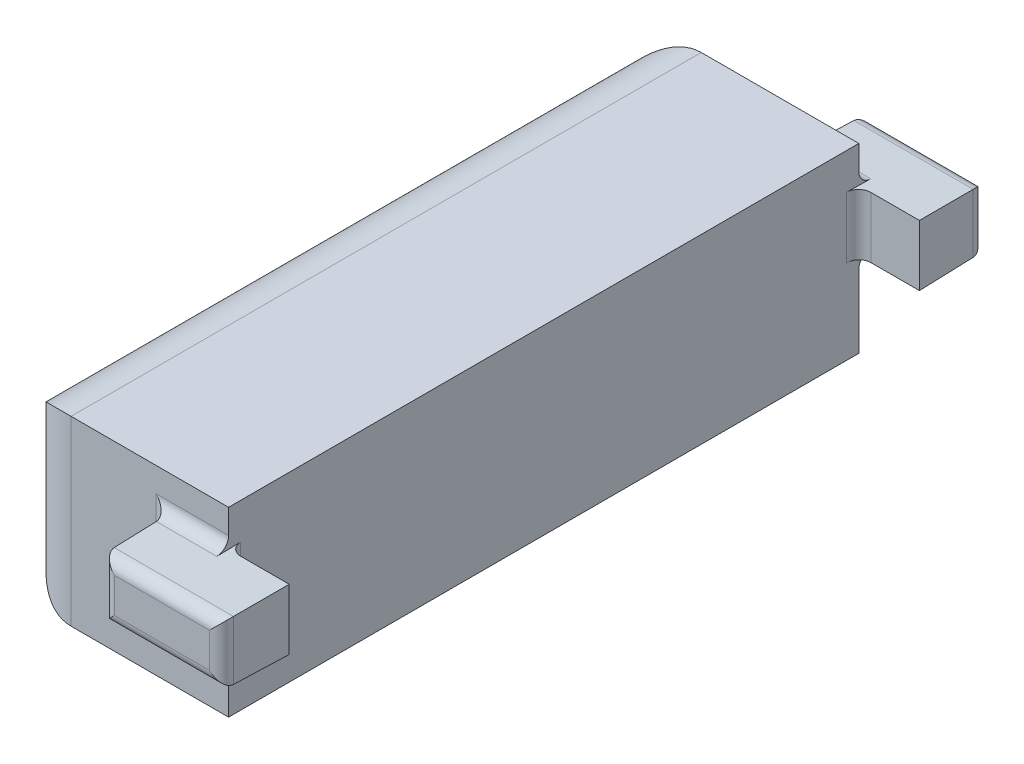
ISO-10303-21;
HEADER;
FILE_DESCRIPTION(('STEP AP214'),'2;1');
FILE_NAME('part.step','',(''),(''),'','','');
FILE_SCHEMA(('AUTOMOTIVE_DESIGN { 1 0 10303 214 1 1 1 1 }'));
ENDSEC;
DATA;
#1=APPLICATION_CONTEXT('core data for automotive mechanical design processes');
#2=APPLICATION_PROTOCOL_DEFINITION('international standard','automotive_design',2000,#1);
#3=PRODUCT_CONTEXT('',#1,'mechanical');
#4=PRODUCT('Part','Part','',(#3));
#5=PRODUCT_RELATED_PRODUCT_CATEGORY('part','',(#4));
#6=PRODUCT_DEFINITION_FORMATION('','',#4);
#7=PRODUCT_DEFINITION_CONTEXT('part definition',#1,'design');
#8=PRODUCT_DEFINITION('design','',#6,#7);
#9=PRODUCT_DEFINITION_SHAPE('','',#8);
#10=(LENGTH_UNIT() NAMED_UNIT(*) SI_UNIT(.MILLI.,.METRE.));
#11=(NAMED_UNIT(*) PLANE_ANGLE_UNIT() SI_UNIT($,.RADIAN.));
#12=(NAMED_UNIT(*) SI_UNIT($,.STERADIAN.) SOLID_ANGLE_UNIT());
#13=UNCERTAINTY_MEASURE_WITH_UNIT(LENGTH_MEASURE(1.E-05),#10,'distance_accuracy_value','');
#14=(GEOMETRIC_REPRESENTATION_CONTEXT(3) GLOBAL_UNCERTAINTY_ASSIGNED_CONTEXT((#13)) GLOBAL_UNIT_ASSIGNED_CONTEXT((#10,
#11,#12)) REPRESENTATION_CONTEXT('',''));
#15=CARTESIAN_POINT('',(0.,0.,0.));
#16=DIRECTION('',(0.,0.,1.));
#17=DIRECTION('',(1.,0.,0.));
#18=AXIS2_PLACEMENT_3D('',#15,#16,#17);
#19=CARTESIAN_POINT('',(-12.15,3.5,-55.9));
#20=DIRECTION('',(0.,0.,-1.));
#21=DIRECTION('',(-1.,0.,0.));
#22=AXIS2_PLACEMENT_3D('',#19,#20,#21);
#23=PLANE('',#22);
#24=DIRECTION('',(-1.,0.,0.));
#25=VECTOR('',#24,1.);
#26=CARTESIAN_POINT('',(-12.15,3.5,-55.9));
#27=LINE('',#26,#25);
#28=CARTESIAN_POINT('',(-12.15,3.5,-55.9));
#29=VERTEX_POINT('',#28);
#30=CARTESIAN_POINT('',(-13.45,3.5,-55.9));
#31=VERTEX_POINT('',#30);
#32=EDGE_CURVE('E294',#29,#31,#27,.T.);
#33=ORIENTED_EDGE('',*,*,#32,.T.);
#34=DIRECTION('',(0.,-1.,0.));
#35=VECTOR('',#34,1.);
#36=CARTESIAN_POINT('',(-13.45,3.5,-55.9));
#37=LINE('',#36,#35);
#38=CARTESIAN_POINT('',(-13.45,2.,-55.9));
#39=VERTEX_POINT('',#38);
#40=EDGE_CURVE('E11',#31,#39,#37,.T.);
#41=ORIENTED_EDGE('',*,*,#40,.T.);
#42=DIRECTION('',(-1.,0.,0.));
#43=VECTOR('',#42,1.);
#44=CARTESIAN_POINT('',(-12.15,2.,-55.9));
#45=LINE('',#44,#43);
#46=CARTESIAN_POINT('',(-12.15,2.,-55.9));
#47=VERTEX_POINT('',#46);
#48=EDGE_CURVE('E300',#47,#39,#45,.T.);
#49=ORIENTED_EDGE('',*,*,#48,.F.);
#50=DIRECTION('',(0.,-1.,0.));
#51=VECTOR('',#50,1.);
#52=CARTESIAN_POINT('',(-12.15,3.5,-55.9));
#53=LINE('',#52,#51);
#54=CARTESIAN_POINT('',(-12.15,2.59989294867711,-55.9));
#55=VERTEX_POINT('',#54);
#56=EDGE_CURVE('E274',#55,#47,#53,.T.);
#57=ORIENTED_EDGE('',*,*,#56,.F.);
#58=DIRECTION('',(-1.,0.,0.));
#59=VECTOR('',#58,1.);
#60=CARTESIAN_POINT('',(-12.65,2.59989294867711,-55.9));
#61=LINE('',#60,#59);
#62=CARTESIAN_POINT('',(-12.7482697263116,2.59989294867711,-55.9));
#63=VERTEX_POINT('',#62);
#64=EDGE_CURVE('E373',#55,#63,#61,.T.);
#65=ORIENTED_EDGE('',*,*,#64,.T.);
#66=DIRECTION('',(0.,1.,0.));
#67=VECTOR('',#66,1.);
#68=CARTESIAN_POINT('',(-12.7482697263116,3.2,-55.9));
#69=LINE('',#68,#67);
#70=CARTESIAN_POINT('',(-12.7482697263116,3.29826972631157,-55.9));
#71=VERTEX_POINT('',#70);
#72=EDGE_CURVE('E371',#63,#71,#69,.T.);
#73=ORIENTED_EDGE('',*,*,#72,.T.);
#74=DIRECTION('',(1.,0.,0.));
#75=VECTOR('',#74,1.);
#76=CARTESIAN_POINT('',(-12.15,3.29826972631157,-55.9));
#77=LINE('',#76,#75);
#78=CARTESIAN_POINT('',(-12.15,3.29826972631157,-55.9));
#79=VERTEX_POINT('',#78);
#80=EDGE_CURVE('E369',#71,#79,#77,.T.);
#81=ORIENTED_EDGE('',*,*,#80,.T.);
#82=EDGE_CURVE('E283',#29,#79,#53,.T.);
#83=ORIENTED_EDGE('',*,*,#82,.F.);
#84=EDGE_LOOP('',(#33,#41,#49,#57,#65,#73,#81,#83));
#85=FACE_BOUND('',#84,.T.);
#86=ADVANCED_FACE('F35',(#85),#23,.F.);
#87=CARTESIAN_POINT('',(-12.15,2.,-55.9));
#88=DIRECTION('',(0.,1.,0.));
#89=DIRECTION('',(0.,0.,1.));
#90=AXIS2_PLACEMENT_3D('',#87,#88,#89);
#91=PLANE('',#90);
#92=ORIENTED_EDGE('',*,*,#48,.T.);
#93=DIRECTION('',(0.,0.,-1.));
#94=VECTOR('',#93,1.);
#95=CARTESIAN_POINT('',(-13.45,2.,-55.9));
#96=LINE('',#95,#94);
#97=CARTESIAN_POINT('',(-13.45,2.,-61.1));
#98=VERTEX_POINT('',#97);
#99=EDGE_CURVE('E428',#39,#98,#96,.T.);
#100=ORIENTED_EDGE('',*,*,#99,.T.);
#101=DIRECTION('',(-1.,0.,0.));
#102=VECTOR('',#101,1.);
#103=CARTESIAN_POINT('',(-12.15,2.,-61.1));
#104=LINE('',#103,#102);
#105=CARTESIAN_POINT('',(-12.15,2.,-61.1));
#106=VERTEX_POINT('',#105);
#107=EDGE_CURVE('E298',#106,#98,#104,.T.);
#108=ORIENTED_EDGE('',*,*,#107,.F.);
#109=DIRECTION('',(0.,0.,-1.));
#110=VECTOR('',#109,1.);
#111=CARTESIAN_POINT('',(-12.15,2.,-55.9));
#112=LINE('',#111,#110);
#113=EDGE_CURVE('E286',#47,#106,#112,.T.);
#114=ORIENTED_EDGE('',*,*,#113,.F.);
#115=EDGE_LOOP('',(#92,#100,#108,#114));
#116=FACE_BOUND('',#115,.T.);
#117=ADVANCED_FACE('F469',(#116),#91,.F.);
#118=CARTESIAN_POINT('',(-12.15,3.5,-61.1));
#119=DIRECTION('',(0.,0.,1.));
#120=DIRECTION('',(1.,0.,0.));
#121=AXIS2_PLACEMENT_3D('',#118,#119,#120);
#122=PLANE('',#121);
#123=ORIENTED_EDGE('',*,*,#107,.T.);
#124=DIRECTION('',(0.,1.,0.));
#125=VECTOR('',#124,1.);
#126=CARTESIAN_POINT('',(-13.45,3.5,-61.1));
#127=LINE('',#126,#125);
#128=CARTESIAN_POINT('',(-13.45,3.5,-61.1));
#129=VERTEX_POINT('',#128);
#130=EDGE_CURVE('E59',#98,#129,#127,.T.);
#131=ORIENTED_EDGE('',*,*,#130,.T.);
#132=DIRECTION('',(-1.,0.,0.));
#133=VECTOR('',#132,1.);
#134=CARTESIAN_POINT('',(-12.15,3.5,-61.1));
#135=LINE('',#134,#133);
#136=CARTESIAN_POINT('',(-12.15,3.5,-61.1));
#137=VERTEX_POINT('',#136);
#138=EDGE_CURVE('E296',#137,#129,#135,.T.);
#139=ORIENTED_EDGE('',*,*,#138,.F.);
#140=DIRECTION('',(0.,1.,0.));
#141=VECTOR('',#140,1.);
#142=CARTESIAN_POINT('',(-12.15,3.5,-61.1));
#143=LINE('',#142,#141);
#144=CARTESIAN_POINT('',(-12.15,3.29826972631157,-61.1));
#145=VERTEX_POINT('',#144);
#146=EDGE_CURVE('E288',#145,#137,#143,.T.);
#147=ORIENTED_EDGE('',*,*,#146,.F.);
#148=DIRECTION('',(-1.,0.,0.));
#149=VECTOR('',#148,1.);
#150=CARTESIAN_POINT('',(-12.15,3.29826972631157,-61.1));
#151=LINE('',#150,#149);
#152=CARTESIAN_POINT('',(-12.7482697263116,3.29826972631157,-61.1));
#153=VERTEX_POINT('',#152);
#154=EDGE_CURVE('E366',#145,#153,#151,.T.);
#155=ORIENTED_EDGE('',*,*,#154,.T.);
#156=DIRECTION('',(0.,-1.,0.));
#157=VECTOR('',#156,1.);
#158=CARTESIAN_POINT('',(-12.7482697263116,3.5,-61.1));
#159=LINE('',#158,#157);
#160=CARTESIAN_POINT('',(-12.7482697263116,2.59989294867711,-61.1));
#161=VERTEX_POINT('',#160);
#162=EDGE_CURVE('E362',#153,#161,#159,.T.);
#163=ORIENTED_EDGE('',*,*,#162,.T.);
#164=DIRECTION('',(1.,0.,0.));
#165=VECTOR('',#164,1.);
#166=CARTESIAN_POINT('',(-12.15,2.59989294867711,-61.1));
#167=LINE('',#166,#165);
#168=CARTESIAN_POINT('',(-12.15,2.59989294867711,-61.1));
#169=VERTEX_POINT('',#168);
#170=EDGE_CURVE('E364',#161,#169,#167,.T.);
#171=ORIENTED_EDGE('',*,*,#170,.T.);
#172=EDGE_CURVE('E289',#106,#169,#143,.T.);
#173=ORIENTED_EDGE('',*,*,#172,.F.);
#174=EDGE_LOOP('',(#123,#131,#139,#147,#155,#163,#171,#173));
#175=FACE_BOUND('',#174,.T.);
#176=ADVANCED_FACE('F473',(#175),#122,.F.);
#177=CARTESIAN_POINT('',(-12.15,3.5,-55.9));
#178=DIRECTION('',(0.,-1.,0.));
#179=DIRECTION('',(0.,0.,-1.));
#180=AXIS2_PLACEMENT_3D('',#177,#178,#179);
#181=PLANE('',#180);
#182=ORIENTED_EDGE('',*,*,#138,.T.);
#183=DIRECTION('',(0.,0.,1.));
#184=VECTOR('',#183,1.);
#185=CARTESIAN_POINT('',(-13.45,3.5,-55.9));
#186=LINE('',#185,#184);
#187=EDGE_CURVE('E44',#129,#31,#186,.T.);
#188=ORIENTED_EDGE('',*,*,#187,.T.);
#189=ORIENTED_EDGE('',*,*,#32,.F.);
#190=DIRECTION('',(0.,0.,1.));
#191=VECTOR('',#190,1.);
#192=CARTESIAN_POINT('',(-12.15,3.5,-55.9));
#193=LINE('',#192,#191);
#194=EDGE_CURVE('E292',#137,#29,#193,.T.);
#195=ORIENTED_EDGE('',*,*,#194,.F.);
#196=EDGE_LOOP('',(#182,#188,#189,#195));
#197=FACE_BOUND('',#196,.T.);
#198=ADVANCED_FACE('F773',(#197),#181,.F.);
#199=CARTESIAN_POINT('',(-12.15,0.,0.));
#200=DIRECTION('',(1.,0.,0.));
#201=DIRECTION('',(0.,0.,-1.));
#202=AXIS2_PLACEMENT_3D('',#199,#200,#201);
#203=PLANE('',#202);
#204=DIRECTION('',(0.,-1.,0.));
#205=VECTOR('',#204,1.);
#206=CARTESIAN_POINT('',(-12.15,2.69816267498868,-56.));
#207=LINE('',#206,#205);
#208=CARTESIAN_POINT('',(-12.15,3.20174550649282,-56.));
#209=VERTEX_POINT('',#208);
#210=CARTESIAN_POINT('',(-12.15,2.69641716849586,-56.));
#211=VERTEX_POINT('',#210);
#212=EDGE_CURVE('E413',#209,#211,#207,.T.);
#213=ORIENTED_EDGE('',*,*,#212,.T.);
#214=DIRECTION('',(0.,0.0174524064372835,0.999847695156391));
#215=VECTOR('',#214,1.);
#216=CARTESIAN_POINT('',(-12.15,2.69816267498868,-55.9));
#217=LINE('',#216,#215);
#218=CARTESIAN_POINT('',(-12.15,2.69987771819275,-55.8017452406437));
#219=VERTEX_POINT('',#218);
#220=EDGE_CURVE('E340',#219,#211,#217,.F.);
#221=ORIENTED_EDGE('',*,*,#220,.F.);
#222=CARTESIAN_POINT('',(-12.15,2.59989294867711,-55.8));
#223=DIRECTION('',(1.,0.,0.));
#224=DIRECTION('',(0.,0.,-1.));
#225=AXIS2_PLACEMENT_3D('',#222,#223,#224);
#226=CIRCLE('',#225,0.1);
#227=EDGE_CURVE('E379',#219,#55,#226,.F.);
#228=ORIENTED_EDGE('',*,*,#227,.T.);
#229=ORIENTED_EDGE('',*,*,#56,.T.);
#230=ORIENTED_EDGE('',*,*,#113,.T.);
#231=ORIENTED_EDGE('',*,*,#172,.T.);
#232=CARTESIAN_POINT('',(-12.15,2.59989294867711,-61.2));
#233=DIRECTION('',(1.,0.,0.));
#234=DIRECTION('',(0.,0.,-1.));
#235=AXIS2_PLACEMENT_3D('',#232,#233,#234);
#236=CIRCLE('',#235,0.1);
#237=CARTESIAN_POINT('',(-12.15,2.69987771819275,-61.1982547593563));
#238=VERTEX_POINT('',#237);
#239=EDGE_CURVE('E377',#169,#238,#236,.F.);
#240=ORIENTED_EDGE('',*,*,#239,.T.);
#241=DIRECTION('',(0.,0.0174524064372835,-0.999847695156391));
#242=VECTOR('',#241,1.);
#243=CARTESIAN_POINT('',(-12.15,1.63116122682743,0.0284720251226639));
#244=LINE('',#243,#242);
#245=CARTESIAN_POINT('',(-12.15,2.69641716849586,-61.));
#246=VERTEX_POINT('',#245);
#247=EDGE_CURVE('E324',#246,#238,#244,.T.);
#248=ORIENTED_EDGE('',*,*,#247,.F.);
#249=DIRECTION('',(0.,1.,0.));
#250=VECTOR('',#249,1.);
#251=CARTESIAN_POINT('',(-12.15,3.2,-61.));
#252=LINE('',#251,#250);
#253=CARTESIAN_POINT('',(-12.15,3.20174550649282,-61.));
#254=VERTEX_POINT('',#253);
#255=EDGE_CURVE('E383',#246,#254,#252,.T.);
#256=ORIENTED_EDGE('',*,*,#255,.T.);
#257=DIRECTION('',(0.,0.0174524064372835,0.999847695156391));
#258=VECTOR('',#257,1.);
#259=CARTESIAN_POINT('',(-12.15,4.26520494749196,-0.0744494292906272));
#260=LINE('',#259,#258);
#261=CARTESIAN_POINT('',(-12.15,3.19828495679593,-61.1982547593563));
#262=VERTEX_POINT('',#261);
#263=EDGE_CURVE('E303',#262,#254,#260,.T.);
#264=ORIENTED_EDGE('',*,*,#263,.F.);
#265=CARTESIAN_POINT('',(-12.15,3.29826972631157,-61.2));
#266=DIRECTION('',(1.,0.,0.));
#267=DIRECTION('',(0.,0.,-1.));
#268=AXIS2_PLACEMENT_3D('',#265,#266,#267);
#269=CIRCLE('',#268,0.1);
#270=EDGE_CURVE('E375',#262,#145,#269,.F.);
#271=ORIENTED_EDGE('',*,*,#270,.T.);
#272=ORIENTED_EDGE('',*,*,#146,.T.);
#273=ORIENTED_EDGE('',*,*,#194,.T.);
#274=ORIENTED_EDGE('',*,*,#82,.T.);
#275=CARTESIAN_POINT('',(-12.15,3.29826972631157,-55.8));
#276=DIRECTION('',(1.,0.,0.));
#277=DIRECTION('',(0.,0.,-1.));
#278=AXIS2_PLACEMENT_3D('',#275,#276,#277);
#279=CIRCLE('',#278,0.1);
#280=CARTESIAN_POINT('',(-12.15,3.19828495679593,-55.8017452406437));
#281=VERTEX_POINT('',#280);
#282=EDGE_CURVE('E381',#79,#281,#279,.F.);
#283=ORIENTED_EDGE('',*,*,#282,.T.);
#284=DIRECTION('',(0.,0.0174524064372835,-0.999847695156391));
#285=VECTOR('',#284,1.);
#286=CARTESIAN_POINT('',(-12.15,3.2,-55.9));
#287=LINE('',#286,#285);
#288=EDGE_CURVE('E347',#209,#281,#287,.F.);
#289=ORIENTED_EDGE('',*,*,#288,.F.);
#290=EDGE_LOOP('',(#213,#221,#228,#229,#230,#231,#240,#248,#256,#264,#271,#272,#273,#274,#283,#289));
#291=FACE_BOUND('',#290,.T.);
#292=ADVANCED_FACE('F477',(#291),#203,.T.);
#293=CARTESIAN_POINT('',(-13.95,0.,0.));
#294=DIRECTION('',(1.,0.,0.));
#295=DIRECTION('',(0.,0.,-1.));
#296=AXIS2_PLACEMENT_3D('',#293,#294,#295);
#297=PLANE('',#296);
#298=DIRECTION('',(0.,1.,0.));
#299=VECTOR('',#298,1.);
#300=CARTESIAN_POINT('',(-13.95,0.,-60.6));
#301=LINE('',#300,#299);
#302=CARTESIAN_POINT('',(-13.95,3.,-60.6));
#303=VERTEX_POINT('',#302);
#304=CARTESIAN_POINT('',(-13.95,2.5,-60.6));
#305=VERTEX_POINT('',#304);
#306=EDGE_CURVE('E435',#303,#305,#301,.F.);
#307=ORIENTED_EDGE('',*,*,#306,.T.);
#308=DIRECTION('',(0.,0.,-1.));
#309=VECTOR('',#308,1.);
#310=CARTESIAN_POINT('',(-13.95,2.5,0.));
#311=LINE('',#310,#309);
#312=CARTESIAN_POINT('',(-13.95,2.5,-56.4));
#313=VERTEX_POINT('',#312);
#314=EDGE_CURVE('E437',#305,#313,#311,.F.);
#315=ORIENTED_EDGE('',*,*,#314,.T.);
#316=DIRECTION('',(0.,-1.,0.));
#317=VECTOR('',#316,1.);
#318=CARTESIAN_POINT('',(-13.95,0.,-56.4));
#319=LINE('',#318,#317);
#320=CARTESIAN_POINT('',(-13.95,3.,-56.4));
#321=VERTEX_POINT('',#320);
#322=EDGE_CURVE('E431',#313,#321,#319,.F.);
#323=ORIENTED_EDGE('',*,*,#322,.T.);
#324=DIRECTION('',(0.,0.,1.));
#325=VECTOR('',#324,1.);
#326=CARTESIAN_POINT('',(-13.95,3.,0.));
#327=LINE('',#326,#325);
#328=EDGE_CURVE('E433',#321,#303,#327,.F.);
#329=ORIENTED_EDGE('',*,*,#328,.T.);
#330=EDGE_LOOP('',(#307,#315,#323,#329));
#331=FACE_BOUND('',#330,.T.);
#332=ADVANCED_FACE('F460',(#331),#297,.F.);
#333=CARTESIAN_POINT('',(0.,0.,-55.9));
#334=DIRECTION('',(0.,0.,-1.));
#335=DIRECTION('',(-1.,0.,0.));
#336=AXIS2_PLACEMENT_3D('',#333,#334,#335);
#337=PLANE('',#336);
#338=DIRECTION('',(1.,0.,0.));
#339=VECTOR('',#338,1.);
#340=CARTESIAN_POINT('',(-11.65,2.69816267498868,-55.9));
#341=LINE('',#340,#339);
#342=CARTESIAN_POINT('',(-12.05,2.69816267498868,-55.9));
#343=VERTEX_POINT('',#342);
#344=CARTESIAN_POINT('',(-11.65,2.69816267498868,-55.9));
#345=VERTEX_POINT('',#344);
#346=EDGE_CURVE('E269',#343,#345,#341,.T.);
#347=ORIENTED_EDGE('',*,*,#346,.F.);
#348=DIRECTION('',(0.,-1.,0.));
#349=VECTOR('',#348,1.);
#350=CARTESIAN_POINT('',(-12.05,3.2,-55.9));
#351=LINE('',#350,#349);
#352=CARTESIAN_POINT('',(-12.05,3.2,-55.9));
#353=VERTEX_POINT('',#352);
#354=EDGE_CURVE('E416',#343,#353,#351,.F.);
#355=ORIENTED_EDGE('',*,*,#354,.T.);
#356=DIRECTION('',(-1.,0.,0.));
#357=VECTOR('',#356,1.);
#358=CARTESIAN_POINT('',(-11.65,3.2,-55.9));
#359=LINE('',#358,#357);
#360=CARTESIAN_POINT('',(-11.65,3.2,-55.9));
#361=VERTEX_POINT('',#360);
#362=EDGE_CURVE('E266',#361,#353,#359,.T.);
#363=ORIENTED_EDGE('',*,*,#362,.F.);
#364=DIRECTION('',(0.,1.,0.));
#365=VECTOR('',#364,1.);
#366=CARTESIAN_POINT('',(-11.65,3.2,-55.9));
#367=LINE('',#366,#365);
#368=EDGE_CURVE('E245',#345,#361,#367,.T.);
#369=ORIENTED_EDGE('',*,*,#368,.F.);
#370=EDGE_LOOP('',(#347,#355,#363,#369));
#371=FACE_BOUND('',#370,.T.);
#372=ADVANCED_FACE('F724',(#371),#337,.T.);
#373=CARTESIAN_POINT('',(-11.65,3.2,-55.9));
#374=DIRECTION('',(0.999847695156391,0.,0.0174524064372835));
#375=DIRECTION('',(0.0174524064372835,0.,-0.999847695156391));
#376=AXIS2_PLACEMENT_3D('',#373,#374,#375);
#377=PLANE('',#376);
#378=DIRECTION('',(0.0174497491606827,0.0174497491606827,-0.999695459881887));
#379=VECTOR('',#378,1.);
#380=CARTESIAN_POINT('',(-11.65,3.2,-55.9));
#381=LINE('',#380,#379);
#382=CARTESIAN_POINT('',(-11.6578852425065,3.19211475749355,-55.4482547593563));
#383=VERTEX_POINT('',#382);
#384=EDGE_CURVE('E272',#383,#361,#381,.T.);
#385=ORIENTED_EDGE('',*,*,#384,.F.);
#386=DIRECTION('',(0.,1.,0.));
#387=VECTOR('',#386,1.);
#388=CARTESIAN_POINT('',(-11.6578852425065,3.2,-55.4482547593563));
#389=LINE('',#388,#387);
#390=CARTESIAN_POINT('',(-11.6578852425065,2.70604791749513,-55.4482547593563));
#391=VERTEX_POINT('',#390);
#392=EDGE_CURVE('E337',#383,#391,#389,.F.);
#393=ORIENTED_EDGE('',*,*,#392,.T.);
#394=DIRECTION('',(0.0174497491606827,-0.0174497491606827,-0.999695459881887));
#395=VECTOR('',#394,1.);
#396=CARTESIAN_POINT('',(-11.6501528063269,2.69831548131554,-55.8912457313972));
#397=LINE('',#396,#395);
#398=EDGE_CURVE('E271',#391,#345,#397,.T.);
#399=ORIENTED_EDGE('',*,*,#398,.T.);
#400=ORIENTED_EDGE('',*,*,#368,.T.);
#401=EDGE_LOOP('',(#385,#393,#399,#400));
#402=FACE_BOUND('',#401,.T.);
#403=ADVANCED_FACE('F720',(#402),#377,.T.);
#404=CARTESIAN_POINT('',(-11.65,3.2,-55.9));
#405=DIRECTION('',(0.,0.999847695156391,0.0174524064372835));
#406=DIRECTION('',(0.,-0.0174524064372835,0.999847695156391));
#407=AXIS2_PLACEMENT_3D('',#404,#405,#406);
#408=PLANE('',#407);
#409=DIRECTION('',(-0.0174497491606827,0.0174497491606827,-0.999695459881887));
#410=VECTOR('',#409,1.);
#411=CARTESIAN_POINT('',(-12.65,3.2,-55.9));
#412=LINE('',#411,#410);
#413=CARTESIAN_POINT('',(-12.6421147574935,3.19211475749355,-55.4482547593563));
#414=VERTEX_POINT('',#413);
#415=CARTESIAN_POINT('',(-12.6482849567959,3.19828495679593,-55.8017452406437));
#416=VERTEX_POINT('',#415);
#417=EDGE_CURVE('E275',#414,#416,#412,.T.);
#418=ORIENTED_EDGE('',*,*,#417,.F.);
#419=DIRECTION('',(-1.,0.,0.));
#420=VECTOR('',#419,1.);
#421=CARTESIAN_POINT('',(-11.65,3.19211475749355,-55.4482547593563));
#422=LINE('',#421,#420);
#423=EDGE_CURVE('E352',#414,#383,#422,.F.);
#424=ORIENTED_EDGE('',*,*,#423,.T.);
#425=ORIENTED_EDGE('',*,*,#384,.T.);
#426=ORIENTED_EDGE('',*,*,#362,.T.);
#427=CARTESIAN_POINT('',(-12.05,3.20174550649282,-56.));
#428=DIRECTION('',(0.,0.999847695156391,0.0174524064372835));
#429=DIRECTION('',(0.,0.0174524064372835,-0.999847695156391));
#430=AXIS2_PLACEMENT_3D('',#427,#428,#429);
#431=ELLIPSE('',#430,0.100015232804391,0.1);
#432=EDGE_CURVE('E421',#353,#209,#431,.F.);
#433=ORIENTED_EDGE('',*,*,#432,.T.);
#434=ORIENTED_EDGE('',*,*,#288,.T.);
#435=DIRECTION('',(-1.,0.,0.));
#436=VECTOR('',#435,1.);
#437=CARTESIAN_POINT('',(-12.65,3.19828495679593,-55.8017452406437));
#438=LINE('',#437,#436);
#439=EDGE_CURVE('E350',#281,#416,#438,.T.);
#440=ORIENTED_EDGE('',*,*,#439,.T.);
#441=EDGE_LOOP('',(#418,#424,#425,#426,#433,#434,#440));
#442=FACE_BOUND('',#441,.T.);
#443=ADVANCED_FACE('F712',(#442),#408,.T.);
#444=CARTESIAN_POINT('',(-12.65,3.2,-55.9));
#445=DIRECTION('',(-0.999847695156391,0.,0.0174524064372835));
#446=DIRECTION('',(0.0174524064372835,0.,0.999847695156391));
#447=AXIS2_PLACEMENT_3D('',#444,#445,#446);
#448=PLANE('',#447);
#449=DIRECTION('',(-0.0174497491606827,-0.0174497491606827,-0.999695459881887));
#450=VECTOR('',#449,1.);
#451=CARTESIAN_POINT('',(-12.6496955062542,2.69846716873445,-55.882555564988));
#452=LINE('',#451,#450);
#453=CARTESIAN_POINT('',(-12.6421147574935,2.70604791749513,-55.4482547593563));
#454=VERTEX_POINT('',#453);
#455=CARTESIAN_POINT('',(-12.6482849567959,2.69987771819275,-55.8017452406437));
#456=VERTEX_POINT('',#455);
#457=EDGE_CURVE('E278',#454,#456,#452,.T.);
#458=ORIENTED_EDGE('',*,*,#457,.F.);
#459=DIRECTION('',(0.,-1.,0.));
#460=VECTOR('',#459,1.);
#461=CARTESIAN_POINT('',(-12.6421147574935,3.2,-55.4482547593563));
#462=LINE('',#461,#460);
#463=EDGE_CURVE('E356',#454,#414,#462,.F.);
#464=ORIENTED_EDGE('',*,*,#463,.T.);
#465=ORIENTED_EDGE('',*,*,#417,.T.);
#466=DIRECTION('',(0.,-1.,0.));
#467=VECTOR('',#466,1.);
#468=CARTESIAN_POINT('',(-12.6482849567959,2.69816267498868,-55.8017452406437));
#469=LINE('',#468,#467);
#470=EDGE_CURVE('E354',#416,#456,#469,.T.);
#471=ORIENTED_EDGE('',*,*,#470,.T.);
#472=EDGE_LOOP('',(#458,#464,#465,#471));
#473=FACE_BOUND('',#472,.T.);
#474=ADVANCED_FACE('F707',(#473),#448,.T.);
#475=CARTESIAN_POINT('',(-11.65,2.69816267498868,-55.9));
#476=DIRECTION('',(0.,-0.999847695156391,0.0174524064372835));
#477=DIRECTION('',(0.,-0.0174524064372835,-0.999847695156391));
#478=AXIS2_PLACEMENT_3D('',#475,#476,#477);
#479=PLANE('',#478);
#480=ORIENTED_EDGE('',*,*,#398,.F.);
#481=DIRECTION('',(1.,0.,0.));
#482=VECTOR('',#481,1.);
#483=CARTESIAN_POINT('',(-11.65,2.70604791749513,-55.4482547593563));
#484=LINE('',#483,#482);
#485=EDGE_CURVE('E345',#391,#454,#484,.F.);
#486=ORIENTED_EDGE('',*,*,#485,.T.);
#487=ORIENTED_EDGE('',*,*,#457,.T.);
#488=DIRECTION('',(1.,0.,0.));
#489=VECTOR('',#488,1.);
#490=CARTESIAN_POINT('',(-12.15,2.69987771819275,-55.8017452406437));
#491=LINE('',#490,#489);
#492=EDGE_CURVE('E342',#456,#219,#491,.T.);
#493=ORIENTED_EDGE('',*,*,#492,.T.);
#494=ORIENTED_EDGE('',*,*,#220,.T.);
#495=CARTESIAN_POINT('',(-12.05,2.69641716849586,-56.));
#496=DIRECTION('',(0.,-0.999847695156391,0.0174524064372835));
#497=DIRECTION('',(0.,0.0174524064372835,0.999847695156391));
#498=AXIS2_PLACEMENT_3D('',#495,#496,#497);
#499=ELLIPSE('',#498,0.100015232804391,0.1);
#500=EDGE_CURVE('E419',#211,#343,#499,.F.);
#501=ORIENTED_EDGE('',*,*,#500,.T.);
#502=ORIENTED_EDGE('',*,*,#346,.T.);
#503=EDGE_LOOP('',(#480,#486,#487,#493,#494,#501,#502));
#504=FACE_BOUND('',#503,.T.);
#505=ADVANCED_FACE('F699',(#504),#479,.T.);
#506=CARTESIAN_POINT('',(0.,0.,-55.35));
#507=DIRECTION('',(0.,0.,-1.));
#508=DIRECTION('',(-1.,0.,0.));
#509=AXIS2_PLACEMENT_3D('',#506,#507,#508);
#510=PLANE('',#509);
#511=DIRECTION('',(-1.,0.,0.));
#512=VECTOR('',#511,1.);
#513=CARTESIAN_POINT('',(0.,2.80603268701077,-55.35));
#514=LINE('',#513,#512);
#515=CARTESIAN_POINT('',(-12.5421299879779,2.80603268701077,-55.35));
#516=VERTEX_POINT('',#515);
#517=CARTESIAN_POINT('',(-11.7578700120221,2.80603268701077,-55.35));
#518=VERTEX_POINT('',#517);
#519=EDGE_CURVE('E332',#516,#518,#514,.F.);
#520=ORIENTED_EDGE('',*,*,#519,.T.);
#521=DIRECTION('',(0.,-1.,0.));
#522=VECTOR('',#521,1.);
#523=CARTESIAN_POINT('',(-11.7578700120221,0.,-55.35));
#524=LINE('',#523,#522);
#525=CARTESIAN_POINT('',(-11.7578700120221,3.09212998797791,-55.35));
#526=VERTEX_POINT('',#525);
#527=EDGE_CURVE('E334',#518,#526,#524,.F.);
#528=ORIENTED_EDGE('',*,*,#527,.T.);
#529=DIRECTION('',(1.,0.,0.));
#530=VECTOR('',#529,1.);
#531=CARTESIAN_POINT('',(0.,3.09212998797792,-55.35));
#532=LINE('',#531,#530);
#533=CARTESIAN_POINT('',(-12.5421299879779,3.09212998797791,-55.35));
#534=VERTEX_POINT('',#533);
#535=EDGE_CURVE('E330',#526,#534,#532,.F.);
#536=ORIENTED_EDGE('',*,*,#535,.T.);
#537=DIRECTION('',(0.,1.,0.));
#538=VECTOR('',#537,1.);
#539=CARTESIAN_POINT('',(-12.5421299879779,0.,-55.35));
#540=LINE('',#539,#538);
#541=EDGE_CURVE('E328',#534,#516,#540,.F.);
#542=ORIENTED_EDGE('',*,*,#541,.T.);
#543=EDGE_LOOP('',(#520,#528,#536,#542));
#544=FACE_BOUND('',#543,.T.);
#545=ADVANCED_FACE('F694',(#544),#510,.F.);
#546=CARTESIAN_POINT('',(0.,0.,-61.1));
#547=DIRECTION('',(0.,0.,1.));
#548=DIRECTION('',(-1.,0.,0.));
#549=AXIS2_PLACEMENT_3D('',#546,#547,#548);
#550=PLANE('',#549);
#551=DIRECTION('',(-1.,0.,0.));
#552=VECTOR('',#551,1.);
#553=CARTESIAN_POINT('',(-11.65,3.2,-61.1));
#554=LINE('',#553,#552);
#555=CARTESIAN_POINT('',(-11.65,3.2,-61.1));
#556=VERTEX_POINT('',#555);
#557=CARTESIAN_POINT('',(-12.05,3.2,-61.1));
#558=VERTEX_POINT('',#557);
#559=EDGE_CURVE('E235',#556,#558,#554,.T.);
#560=ORIENTED_EDGE('',*,*,#559,.T.);
#561=DIRECTION('',(0.,1.,0.));
#562=VECTOR('',#561,1.);
#563=CARTESIAN_POINT('',(-12.05,2.69816267498868,-61.1));
#564=LINE('',#563,#562);
#565=CARTESIAN_POINT('',(-12.05,2.69816267498868,-61.1));
#566=VERTEX_POINT('',#565);
#567=EDGE_CURVE('E231',#558,#566,#564,.F.);
#568=ORIENTED_EDGE('',*,*,#567,.T.);
#569=DIRECTION('',(1.,0.,0.));
#570=VECTOR('',#569,1.);
#571=CARTESIAN_POINT('',(-11.65,2.69816267498868,-61.1));
#572=LINE('',#571,#570);
#573=CARTESIAN_POINT('',(-11.65,2.69816267498868,-61.1));
#574=VERTEX_POINT('',#573);
#575=EDGE_CURVE('E223',#566,#574,#572,.T.);
#576=ORIENTED_EDGE('',*,*,#575,.T.);
#577=DIRECTION('',(0.,1.,0.));
#578=VECTOR('',#577,1.);
#579=CARTESIAN_POINT('',(-11.65,3.2,-61.1));
#580=LINE('',#579,#578);
#581=EDGE_CURVE('E228',#574,#556,#580,.T.);
#582=ORIENTED_EDGE('',*,*,#581,.T.);
#583=EDGE_LOOP('',(#560,#568,#576,#582));
#584=FACE_BOUND('',#583,.T.);
#585=ADVANCED_FACE('F226',(#584),#550,.T.);
#586=CARTESIAN_POINT('',(-11.65,3.2,-61.1));
#587=DIRECTION('',(0.999847695156391,0.,-0.0174524064372835));
#588=DIRECTION('',(-0.0174524064372835,0.,-0.999847695156391));
#589=AXIS2_PLACEMENT_3D('',#586,#587,#588);
#590=PLANE('',#589);
#591=DIRECTION('',(0.0174497491606827,-0.0174497491606827,0.999695459881887));
#592=VECTOR('',#591,1.);
#593=CARTESIAN_POINT('',(-11.65,2.69816267498868,-61.1));
#594=LINE('',#593,#592);
#595=CARTESIAN_POINT('',(-11.6578852425065,2.70604791749513,-61.5517452406437));
#596=VERTEX_POINT('',#595);
#597=EDGE_CURVE('E238',#596,#574,#594,.T.);
#598=ORIENTED_EDGE('',*,*,#597,.F.);
#599=DIRECTION('',(0.,1.,0.));
#600=VECTOR('',#599,1.);
#601=CARTESIAN_POINT('',(-11.6578852425065,3.19039971428948,-61.5517452406437));
#602=LINE('',#601,#600);
#603=CARTESIAN_POINT('',(-11.6578852425065,3.19211475749355,-61.5517452406437));
#604=VERTEX_POINT('',#603);
#605=EDGE_CURVE('E320',#596,#604,#602,.T.);
#606=ORIENTED_EDGE('',*,*,#605,.T.);
#607=DIRECTION('',(0.0174497491606827,0.0174497491606827,0.999695459881887));
#608=VECTOR('',#607,1.);
#609=CARTESIAN_POINT('',(-11.65,3.2,-61.1));
#610=LINE('',#609,#608);
#611=EDGE_CURVE('E250',#604,#556,#610,.T.);
#612=ORIENTED_EDGE('',*,*,#611,.T.);
#613=ORIENTED_EDGE('',*,*,#581,.F.);
#614=EDGE_LOOP('',(#598,#606,#612,#613));
#615=FACE_BOUND('',#614,.T.);
#616=ADVANCED_FACE('F248',(#615),#590,.T.);
#617=CARTESIAN_POINT('',(-11.65,2.69816267498868,-61.1));
#618=DIRECTION('',(0.,-0.999847695156391,-0.0174524064372835));
#619=DIRECTION('',(0.,0.0174524064372835,-0.999847695156391));
#620=AXIS2_PLACEMENT_3D('',#617,#618,#619);
#621=PLANE('',#620);
#622=DIRECTION('',(-0.0174497491606827,-0.0174497491606827,0.999695459881887));
#623=VECTOR('',#622,1.);
#624=CARTESIAN_POINT('',(-12.6498471936731,2.69831548131554,-61.1087542686028));
#625=LINE('',#624,#623);
#626=CARTESIAN_POINT('',(-12.6421147574935,2.70604791749513,-61.5517452406437));
#627=VERTEX_POINT('',#626);
#628=CARTESIAN_POINT('',(-12.6482849567959,2.69987771819275,-61.1982547593563));
#629=VERTEX_POINT('',#628);
#630=EDGE_CURVE('E246',#627,#629,#625,.T.);
#631=ORIENTED_EDGE('',*,*,#630,.F.);
#632=DIRECTION('',(1.,0.,0.));
#633=VECTOR('',#632,1.);
#634=CARTESIAN_POINT('',(-11.6596002857105,2.70604791749513,-61.5517452406437));
#635=LINE('',#634,#633);
#636=EDGE_CURVE('E242',#627,#596,#635,.T.);
#637=ORIENTED_EDGE('',*,*,#636,.T.);
#638=ORIENTED_EDGE('',*,*,#597,.T.);
#639=ORIENTED_EDGE('',*,*,#575,.F.);
#640=CARTESIAN_POINT('',(-12.05,2.69641716849586,-61.));
#641=DIRECTION('',(0.,-0.999847695156391,-0.0174524064372835));
#642=DIRECTION('',(0.,-0.0174524064372835,0.999847695156391));
#643=AXIS2_PLACEMENT_3D('',#640,#641,#642);
#644=ELLIPSE('',#643,0.100015232804391,0.1);
#645=EDGE_CURVE('E426',#566,#246,#644,.F.);
#646=ORIENTED_EDGE('',*,*,#645,.T.);
#647=ORIENTED_EDGE('',*,*,#247,.T.);
#648=DIRECTION('',(1.,0.,0.));
#649=VECTOR('',#648,1.);
#650=CARTESIAN_POINT('',(-11.65,2.69987771819275,-61.1982547593563));
#651=LINE('',#650,#649);
#652=EDGE_CURVE('E322',#238,#629,#651,.F.);
#653=ORIENTED_EDGE('',*,*,#652,.T.);
#654=EDGE_LOOP('',(#631,#637,#638,#639,#646,#647,#653));
#655=FACE_BOUND('',#654,.T.);
#656=ADVANCED_FACE('F240',(#655),#621,.T.);
#657=CARTESIAN_POINT('',(-12.65,3.2,-61.1));
#658=DIRECTION('',(-0.999847695156391,0.,-0.0174524064372835));
#659=DIRECTION('',(-0.0174524064372835,0.,0.999847695156391));
#660=AXIS2_PLACEMENT_3D('',#657,#658,#659);
#661=PLANE('',#660);
#662=DIRECTION('',(-0.0174497491606827,0.0174497491606827,0.999695459881887));
#663=VECTOR('',#662,1.);
#664=CARTESIAN_POINT('',(-12.6496955062542,3.19969550625423,-61.117444435012));
#665=LINE('',#664,#663);
#666=CARTESIAN_POINT('',(-12.6421147574935,3.19211475749355,-61.5517452406437));
#667=VERTEX_POINT('',#666);
#668=CARTESIAN_POINT('',(-12.6482849567959,3.19828495679593,-61.1982547593563));
#669=VERTEX_POINT('',#668);
#670=EDGE_CURVE('E259',#667,#669,#665,.T.);
#671=ORIENTED_EDGE('',*,*,#670,.F.);
#672=DIRECTION('',(0.,-1.,0.));
#673=VECTOR('',#672,1.);
#674=CARTESIAN_POINT('',(-12.6421147574935,2.7077629606992,-61.5517452406437));
#675=LINE('',#674,#673);
#676=EDGE_CURVE('E360',#667,#627,#675,.T.);
#677=ORIENTED_EDGE('',*,*,#676,.T.);
#678=ORIENTED_EDGE('',*,*,#630,.T.);
#679=DIRECTION('',(0.,-1.,0.));
#680=VECTOR('',#679,1.);
#681=CARTESIAN_POINT('',(-12.6482849567959,3.2,-61.1982547593563));
#682=LINE('',#681,#680);
#683=EDGE_CURVE('E358',#629,#669,#682,.F.);
#684=ORIENTED_EDGE('',*,*,#683,.T.);
#685=EDGE_LOOP('',(#671,#677,#678,#684));
#686=FACE_BOUND('',#685,.T.);
#687=ADVANCED_FACE('F485',(#686),#661,.T.);
#688=CARTESIAN_POINT('',(-11.65,3.2,-61.1));
#689=DIRECTION('',(0.,0.999847695156391,-0.0174524064372835));
#690=DIRECTION('',(0.,0.0174524064372835,0.999847695156391));
#691=AXIS2_PLACEMENT_3D('',#688,#689,#690);
#692=PLANE('',#691);
#693=ORIENTED_EDGE('',*,*,#611,.F.);
#694=DIRECTION('',(-1.,0.,0.));
#695=VECTOR('',#694,1.);
#696=CARTESIAN_POINT('',(-12.6403997142895,3.19211475749355,-61.5517452406437));
#697=LINE('',#696,#695);
#698=EDGE_CURVE('E308',#604,#667,#697,.T.);
#699=ORIENTED_EDGE('',*,*,#698,.T.);
#700=ORIENTED_EDGE('',*,*,#670,.T.);
#701=DIRECTION('',(-1.,0.,0.));
#702=VECTOR('',#701,1.);
#703=CARTESIAN_POINT('',(-11.65,3.19828495679593,-61.1982547593563));
#704=LINE('',#703,#702);
#705=EDGE_CURVE('E305',#669,#262,#704,.F.);
#706=ORIENTED_EDGE('',*,*,#705,.T.);
#707=ORIENTED_EDGE('',*,*,#263,.T.);
#708=CARTESIAN_POINT('',(-12.05,3.20174550649282,-61.));
#709=DIRECTION('',(0.,0.999847695156391,-0.0174524064372835));
#710=DIRECTION('',(0.,-0.0174524064372835,-0.999847695156391));
#711=AXIS2_PLACEMENT_3D('',#708,#709,#710);
#712=ELLIPSE('',#711,0.100015232804391,0.1);
#713=EDGE_CURVE('E424',#254,#558,#712,.F.);
#714=ORIENTED_EDGE('',*,*,#713,.T.);
#715=ORIENTED_EDGE('',*,*,#559,.F.);
#716=EDGE_LOOP('',(#693,#699,#700,#706,#707,#714,#715));
#717=FACE_BOUND('',#716,.T.);
#718=ADVANCED_FACE('F494',(#717),#692,.T.);
#719=CARTESIAN_POINT('',(0.,0.,-61.65));
#720=DIRECTION('',(0.,0.,1.));
#721=DIRECTION('',(-1.,0.,0.));
#722=AXIS2_PLACEMENT_3D('',#719,#720,#721);
#723=PLANE('',#722);
#724=DIRECTION('',(0.,-1.,0.));
#725=VECTOR('',#724,1.);
#726=CARTESIAN_POINT('',(-12.5421299879779,3.19039971428948,-61.65));
#727=LINE('',#726,#725);
#728=CARTESIAN_POINT('',(-12.5421299879779,2.80603268701077,-61.65));
#729=VERTEX_POINT('',#728);
#730=CARTESIAN_POINT('',(-12.5421299879779,3.09212998797791,-61.65));
#731=VERTEX_POINT('',#730);
#732=EDGE_CURVE('E311',#729,#731,#727,.F.);
#733=ORIENTED_EDGE('',*,*,#732,.T.);
#734=DIRECTION('',(-1.,0.,0.));
#735=VECTOR('',#734,1.);
#736=CARTESIAN_POINT('',(-11.6596002857105,3.09212998797791,-61.65));
#737=LINE('',#736,#735);
#738=CARTESIAN_POINT('',(-11.7578700120221,3.09212998797791,-61.65));
#739=VERTEX_POINT('',#738);
#740=EDGE_CURVE('E317',#731,#739,#737,.F.);
#741=ORIENTED_EDGE('',*,*,#740,.T.);
#742=DIRECTION('',(0.,1.,0.));
#743=VECTOR('',#742,1.);
#744=CARTESIAN_POINT('',(-11.7578700120221,2.7077629606992,-61.65));
#745=LINE('',#744,#743);
#746=CARTESIAN_POINT('',(-11.7578700120221,2.80603268701077,-61.65));
#747=VERTEX_POINT('',#746);
#748=EDGE_CURVE('E315',#739,#747,#745,.F.);
#749=ORIENTED_EDGE('',*,*,#748,.T.);
#750=DIRECTION('',(1.,0.,0.));
#751=VECTOR('',#750,1.);
#752=CARTESIAN_POINT('',(-12.6403997142895,2.80603268701077,-61.65));
#753=LINE('',#752,#751);
#754=EDGE_CURVE('E313',#747,#729,#753,.F.);
#755=ORIENTED_EDGE('',*,*,#754,.T.);
#756=EDGE_LOOP('',(#733,#741,#749,#755));
#757=FACE_BOUND('',#756,.T.);
#758=ADVANCED_FACE('F502',(#757),#723,.F.);
#759=CARTESIAN_POINT('',(-11.65,2.80603268701077,-61.55));
#760=DIRECTION('',(-1.,0.,0.));
#761=DIRECTION('',(0.,0.,1.));
#762=AXIS2_PLACEMENT_3D('',#759,#760,#761);
#763=CYLINDRICAL_SURFACE('',#762,0.1);
#764=CARTESIAN_POINT('',(-12.5421299879779,2.80603268701077,-61.55));
#765=DIRECTION('',(-0.707106781186547,0.707106781186547,0.));
#766=DIRECTION('',(0.707106781186547,0.707106781186547,0.));
#767=AXIS2_PLACEMENT_3D('',#764,#765,#766);
#768=ELLIPSE('',#767,0.14142135623731,0.1);
#769=EDGE_CURVE('E254',#729,#627,#768,.T.);
#770=ORIENTED_EDGE('',*,*,#769,.F.);
#771=ORIENTED_EDGE('',*,*,#754,.F.);
#772=CARTESIAN_POINT('',(-11.7578700120221,2.80603268701077,-61.55));
#773=DIRECTION('',(-0.707106781186547,-0.707106781186547,0.));
#774=DIRECTION('',(-0.707106781186547,0.707106781186547,0.));
#775=AXIS2_PLACEMENT_3D('',#772,#773,#774);
#776=ELLIPSE('',#775,0.14142135623731,0.1);
#777=EDGE_CURVE('E251',#596,#747,#776,.F.);
#778=ORIENTED_EDGE('',*,*,#777,.F.);
#779=ORIENTED_EDGE('',*,*,#636,.F.);
#780=EDGE_LOOP('',(#770,#771,#778,#779));
#781=FACE_BOUND('',#780,.T.);
#782=ADVANCED_FACE('F505',(#781),#763,.T.);
#783=CARTESIAN_POINT('',(-11.7578700120221,3.2,-61.55));
#784=DIRECTION('',(0.,-1.,0.));
#785=DIRECTION('',(0.,0.,-1.));
#786=AXIS2_PLACEMENT_3D('',#783,#784,#785);
#787=CYLINDRICAL_SURFACE('',#786,0.1);
#788=ORIENTED_EDGE('',*,*,#777,.T.);
#789=ORIENTED_EDGE('',*,*,#748,.F.);
#790=CARTESIAN_POINT('',(-11.7578700120221,3.09212998797791,-61.55));
#791=DIRECTION('',(0.707106781186548,-0.707106781186547,0.));
#792=DIRECTION('',(-0.707106781186547,-0.707106781186548,0.));
#793=AXIS2_PLACEMENT_3D('',#790,#791,#792);
#794=ELLIPSE('',#793,0.14142135623731,0.1);
#795=EDGE_CURVE('E386',#604,#739,#794,.F.);
#796=ORIENTED_EDGE('',*,*,#795,.F.);
#797=ORIENTED_EDGE('',*,*,#605,.F.);
#798=EDGE_LOOP('',(#788,#789,#796,#797));
#799=FACE_BOUND('',#798,.T.);
#800=ADVANCED_FACE('F508',(#799),#787,.T.);
#801=CARTESIAN_POINT('',(-12.5421299879779,3.2,-61.55));
#802=DIRECTION('',(0.,1.,0.));
#803=DIRECTION('',(0.,0.,1.));
#804=AXIS2_PLACEMENT_3D('',#801,#802,#803);
#805=CYLINDRICAL_SURFACE('',#804,0.1);
#806=ORIENTED_EDGE('',*,*,#769,.T.);
#807=ORIENTED_EDGE('',*,*,#676,.F.);
#808=CARTESIAN_POINT('',(-12.5421299879779,3.09212998797791,-61.55));
#809=DIRECTION('',(0.707106781186547,0.707106781186548,0.));
#810=DIRECTION('',(-0.707106781186548,0.707106781186547,0.));
#811=AXIS2_PLACEMENT_3D('',#808,#809,#810);
#812=ELLIPSE('',#811,0.141421356237309,0.1);
#813=EDGE_CURVE('E384',#731,#667,#812,.T.);
#814=ORIENTED_EDGE('',*,*,#813,.F.);
#815=ORIENTED_EDGE('',*,*,#732,.F.);
#816=EDGE_LOOP('',(#806,#807,#814,#815));
#817=FACE_BOUND('',#816,.T.);
#818=ADVANCED_FACE('F489',(#817),#805,.T.);
#819=CARTESIAN_POINT('',(-11.65,3.09212998797791,-61.55));
#820=DIRECTION('',(1.,0.,0.));
#821=DIRECTION('',(0.,1.,0.));
#822=AXIS2_PLACEMENT_3D('',#819,#820,#821);
#823=CYLINDRICAL_SURFACE('',#822,0.1);
#824=ORIENTED_EDGE('',*,*,#795,.T.);
#825=ORIENTED_EDGE('',*,*,#740,.F.);
#826=ORIENTED_EDGE('',*,*,#813,.T.);
#827=ORIENTED_EDGE('',*,*,#698,.F.);
#828=EDGE_LOOP('',(#824,#825,#826,#827));
#829=FACE_BOUND('',#828,.T.);
#830=ADVANCED_FACE('F498',(#829),#823,.T.);
#831=CARTESIAN_POINT('',(-12.5421299879779,0.,-55.45));
#832=DIRECTION('',(0.,1.,0.));
#833=DIRECTION('',(0.,0.,1.));
#834=AXIS2_PLACEMENT_3D('',#831,#832,#833);
#835=CYLINDRICAL_SURFACE('',#834,0.1);
#836=CARTESIAN_POINT('',(-12.5421299879779,3.09212998797791,-55.45));
#837=DIRECTION('',(0.707106781186547,0.707106781186548,0.));
#838=DIRECTION('',(-0.707106781186548,0.707106781186547,0.));
#839=AXIS2_PLACEMENT_3D('',#836,#837,#838);
#840=ELLIPSE('',#839,0.141421356237309,0.1);
#841=EDGE_CURVE('E396',#414,#534,#840,.T.);
#842=ORIENTED_EDGE('',*,*,#841,.F.);
#843=ORIENTED_EDGE('',*,*,#463,.F.);
#844=CARTESIAN_POINT('',(-12.5421299879779,2.80603268701077,-55.45));
#845=DIRECTION('',(-0.707106781186547,0.707106781186547,0.));
#846=DIRECTION('',(0.707106781186547,0.707106781186547,0.));
#847=AXIS2_PLACEMENT_3D('',#844,#845,#846);
#848=ELLIPSE('',#847,0.14142135623731,0.1);
#849=EDGE_CURVE('E387',#516,#454,#848,.F.);
#850=ORIENTED_EDGE('',*,*,#849,.F.);
#851=ORIENTED_EDGE('',*,*,#541,.F.);
#852=EDGE_LOOP('',(#842,#843,#850,#851));
#853=FACE_BOUND('',#852,.T.);
#854=ADVANCED_FACE('F527',(#853),#835,.T.);
#855=CARTESIAN_POINT('',(0.,2.80603268701077,-55.45));
#856=DIRECTION('',(-1.,0.,0.));
#857=DIRECTION('',(0.,0.,1.));
#858=AXIS2_PLACEMENT_3D('',#855,#856,#857);
#859=CYLINDRICAL_SURFACE('',#858,0.1);
#860=ORIENTED_EDGE('',*,*,#849,.T.);
#861=ORIENTED_EDGE('',*,*,#485,.F.);
#862=CARTESIAN_POINT('',(-11.7578700120221,2.80603268701077,-55.45));
#863=DIRECTION('',(-0.707106781186547,-0.707106781186547,0.));
#864=DIRECTION('',(-0.707106781186547,0.707106781186547,0.));
#865=AXIS2_PLACEMENT_3D('',#862,#863,#864);
#866=ELLIPSE('',#865,0.14142135623731,0.1);
#867=EDGE_CURVE('E393',#518,#391,#866,.F.);
#868=ORIENTED_EDGE('',*,*,#867,.F.);
#869=ORIENTED_EDGE('',*,*,#519,.F.);
#870=EDGE_LOOP('',(#860,#861,#868,#869));
#871=FACE_BOUND('',#870,.T.);
#872=ADVANCED_FACE('F531',(#871),#859,.T.);
#873=CARTESIAN_POINT('',(0.,3.09212998797792,-55.45));
#874=DIRECTION('',(1.,0.,0.));
#875=DIRECTION('',(0.,1.,0.));
#876=AXIS2_PLACEMENT_3D('',#873,#874,#875);
#877=CYLINDRICAL_SURFACE('',#876,0.1);
#878=ORIENTED_EDGE('',*,*,#841,.T.);
#879=ORIENTED_EDGE('',*,*,#535,.F.);
#880=CARTESIAN_POINT('',(-11.7578700120221,3.09212998797791,-55.45));
#881=DIRECTION('',(0.707106781186548,-0.707106781186547,0.));
#882=DIRECTION('',(0.707106781186547,0.707106781186548,0.));
#883=AXIS2_PLACEMENT_3D('',#880,#881,#882);
#884=ELLIPSE('',#883,0.14142135623731,0.1);
#885=EDGE_CURVE('E391',#383,#526,#884,.T.);
#886=ORIENTED_EDGE('',*,*,#885,.F.);
#887=ORIENTED_EDGE('',*,*,#423,.F.);
#888=EDGE_LOOP('',(#878,#879,#886,#887));
#889=FACE_BOUND('',#888,.T.);
#890=ADVANCED_FACE('F537',(#889),#877,.T.);
#891=CARTESIAN_POINT('',(-11.7578700120221,0.,-55.45));
#892=DIRECTION('',(0.,-1.,0.));
#893=DIRECTION('',(0.,0.,-1.));
#894=AXIS2_PLACEMENT_3D('',#891,#892,#893);
#895=CYLINDRICAL_SURFACE('',#894,0.1);
#896=ORIENTED_EDGE('',*,*,#867,.T.);
#897=ORIENTED_EDGE('',*,*,#392,.F.);
#898=ORIENTED_EDGE('',*,*,#885,.T.);
#899=ORIENTED_EDGE('',*,*,#527,.F.);
#900=EDGE_LOOP('',(#896,#897,#898,#899));
#901=FACE_BOUND('',#900,.T.);
#902=ADVANCED_FACE('F554',(#901),#895,.T.);
#903=CARTESIAN_POINT('',(-12.15,2.59989294867711,-61.2));
#904=DIRECTION('',(1.,0.,0.));
#905=DIRECTION('',(0.,0.,-1.));
#906=AXIS2_PLACEMENT_3D('',#903,#904,#905);
#907=CYLINDRICAL_SURFACE('',#906,0.1);
#908=ORIENTED_EDGE('',*,*,#239,.F.);
#909=ORIENTED_EDGE('',*,*,#170,.F.);
#910=CARTESIAN_POINT('',(-12.7482697263116,2.59989294867711,-61.2));
#911=DIRECTION('',(0.707106781186547,-0.707106781186547,0.));
#912=DIRECTION('',(-0.707106781186547,-0.707106781186547,0.));
#913=AXIS2_PLACEMENT_3D('',#910,#911,#912);
#914=ELLIPSE('',#913,0.14142135623731,0.1);
#915=EDGE_CURVE('E394',#629,#161,#914,.T.);
#916=ORIENTED_EDGE('',*,*,#915,.F.);
#917=ORIENTED_EDGE('',*,*,#652,.F.);
#918=EDGE_LOOP('',(#908,#909,#916,#917));
#919=FACE_BOUND('',#918,.T.);
#920=ADVANCED_FACE('F480',(#919),#907,.F.);
#921=CARTESIAN_POINT('',(-12.7482697263116,3.5,-61.2));
#922=DIRECTION('',(0.,-1.,0.));
#923=DIRECTION('',(0.,0.,-1.));
#924=AXIS2_PLACEMENT_3D('',#921,#922,#923);
#925=CYLINDRICAL_SURFACE('',#924,0.1);
#926=ORIENTED_EDGE('',*,*,#915,.T.);
#927=ORIENTED_EDGE('',*,*,#162,.F.);
#928=CARTESIAN_POINT('',(-12.7482697263116,3.29826972631157,-61.2));
#929=DIRECTION('',(-0.707106781186547,-0.707106781186548,0.));
#930=DIRECTION('',(0.707106781186548,-0.707106781186547,0.));
#931=AXIS2_PLACEMENT_3D('',#928,#929,#930);
#932=ELLIPSE('',#931,0.141421356237309,0.1);
#933=EDGE_CURVE('E401',#669,#153,#932,.T.);
#934=ORIENTED_EDGE('',*,*,#933,.F.);
#935=ORIENTED_EDGE('',*,*,#683,.F.);
#936=EDGE_LOOP('',(#926,#927,#934,#935));
#937=FACE_BOUND('',#936,.T.);
#938=ADVANCED_FACE('F547',(#937),#925,.F.);
#939=CARTESIAN_POINT('',(-12.15,3.29826972631157,-61.2));
#940=DIRECTION('',(-1.,0.,0.));
#941=DIRECTION('',(0.,-1.,0.));
#942=AXIS2_PLACEMENT_3D('',#939,#940,#941);
#943=CYLINDRICAL_SURFACE('',#942,0.1);
#944=ORIENTED_EDGE('',*,*,#270,.F.);
#945=ORIENTED_EDGE('',*,*,#705,.F.);
#946=ORIENTED_EDGE('',*,*,#933,.T.);
#947=ORIENTED_EDGE('',*,*,#154,.F.);
#948=EDGE_LOOP('',(#944,#945,#946,#947));
#949=FACE_BOUND('',#948,.T.);
#950=ADVANCED_FACE('F543',(#949),#943,.F.);
#951=CARTESIAN_POINT('',(-11.65,3.29826972631157,-55.8));
#952=DIRECTION('',(-1.,0.,0.));
#953=DIRECTION('',(0.,-1.,0.));
#954=AXIS2_PLACEMENT_3D('',#951,#952,#953);
#955=CYLINDRICAL_SURFACE('',#954,0.1);
#956=ORIENTED_EDGE('',*,*,#282,.F.);
#957=ORIENTED_EDGE('',*,*,#80,.F.);
#958=CARTESIAN_POINT('',(-12.7482697263116,3.29826972631157,-55.8));
#959=DIRECTION('',(-0.707106781186547,-0.707106781186548,0.));
#960=DIRECTION('',(-0.707106781186548,0.707106781186547,0.));
#961=AXIS2_PLACEMENT_3D('',#958,#959,#960);
#962=ELLIPSE('',#961,0.141421356237309,0.1);
#963=EDGE_CURVE('E403',#416,#71,#962,.F.);
#964=ORIENTED_EDGE('',*,*,#963,.F.);
#965=ORIENTED_EDGE('',*,*,#439,.F.);
#966=EDGE_LOOP('',(#956,#957,#964,#965));
#967=FACE_BOUND('',#966,.T.);
#968=ADVANCED_FACE('F546',(#967),#955,.F.);
#969=CARTESIAN_POINT('',(-12.7482697263116,3.2,-55.8));
#970=DIRECTION('',(0.,-1.,0.));
#971=DIRECTION('',(0.,0.,-1.));
#972=AXIS2_PLACEMENT_3D('',#969,#970,#971);
#973=CYLINDRICAL_SURFACE('',#972,0.1);
#974=ORIENTED_EDGE('',*,*,#963,.T.);
#975=ORIENTED_EDGE('',*,*,#72,.F.);
#976=CARTESIAN_POINT('',(-12.7482697263116,2.59989294867711,-55.8));
#977=DIRECTION('',(0.707106781186547,-0.707106781186547,0.));
#978=DIRECTION('',(-0.707106781186547,-0.707106781186547,0.));
#979=AXIS2_PLACEMENT_3D('',#976,#977,#978);
#980=ELLIPSE('',#979,0.14142135623731,0.1);
#981=EDGE_CURVE('E406',#456,#63,#980,.F.);
#982=ORIENTED_EDGE('',*,*,#981,.F.);
#983=ORIENTED_EDGE('',*,*,#470,.F.);
#984=EDGE_LOOP('',(#974,#975,#982,#983));
#985=FACE_BOUND('',#984,.T.);
#986=ADVANCED_FACE('F559',(#985),#973,.F.);
#987=CARTESIAN_POINT('',(-11.65,2.59989294867711,-55.8));
#988=DIRECTION('',(1.,0.,0.));
#989=DIRECTION('',(0.,0.,-1.));
#990=AXIS2_PLACEMENT_3D('',#987,#988,#989);
#991=CYLINDRICAL_SURFACE('',#990,0.1);
#992=ORIENTED_EDGE('',*,*,#981,.T.);
#993=ORIENTED_EDGE('',*,*,#64,.F.);
#994=ORIENTED_EDGE('',*,*,#227,.F.);
#995=ORIENTED_EDGE('',*,*,#492,.F.);
#996=EDGE_LOOP('',(#992,#993,#994,#995));
#997=FACE_BOUND('',#996,.T.);
#998=ADVANCED_FACE('F555',(#997),#991,.F.);
#999=CARTESIAN_POINT('',(-12.05,0.,-56.));
#1000=DIRECTION('',(0.,1.,0.));
#1001=DIRECTION('',(0.,0.,1.));
#1002=AXIS2_PLACEMENT_3D('',#999,#1000,#1001);
#1003=CYLINDRICAL_SURFACE('',#1002,0.1);
#1004=ORIENTED_EDGE('',*,*,#432,.F.);
#1005=ORIENTED_EDGE('',*,*,#354,.F.);
#1006=ORIENTED_EDGE('',*,*,#500,.F.);
#1007=ORIENTED_EDGE('',*,*,#212,.F.);
#1008=EDGE_LOOP('',(#1004,#1005,#1006,#1007));
#1009=FACE_BOUND('',#1008,.T.);
#1010=ADVANCED_FACE('F558',(#1009),#1003,.F.);
#1011=CARTESIAN_POINT('',(-12.05,0.,-61.));
#1012=DIRECTION('',(0.,-1.,0.));
#1013=DIRECTION('',(0.,0.,-1.));
#1014=AXIS2_PLACEMENT_3D('',#1011,#1012,#1013);
#1015=CYLINDRICAL_SURFACE('',#1014,0.1);
#1016=ORIENTED_EDGE('',*,*,#645,.F.);
#1017=ORIENTED_EDGE('',*,*,#567,.F.);
#1018=ORIENTED_EDGE('',*,*,#713,.F.);
#1019=ORIENTED_EDGE('',*,*,#255,.F.);
#1020=EDGE_LOOP('',(#1016,#1017,#1018,#1019));
#1021=FACE_BOUND('',#1020,.T.);
#1022=ADVANCED_FACE('F569',(#1021),#1015,.F.);
#1023=CARTESIAN_POINT('',(-13.45,3.,-55.9));
#1024=DIRECTION('',(0.,0.,1.));
#1025=DIRECTION('',(1.,0.,0.));
#1026=AXIS2_PLACEMENT_3D('',#1023,#1024,#1025);
#1027=CYLINDRICAL_SURFACE('',#1026,0.5);
#1028=CARTESIAN_POINT('',(-13.45,3.,-60.6));
#1029=DIRECTION('',(0.,0.707106781186547,0.707106781186547));
#1030=DIRECTION('',(0.,-0.707106781186547,0.707106781186547));
#1031=AXIS2_PLACEMENT_3D('',#1028,#1029,#1030);
#1032=ELLIPSE('',#1031,0.707106781186547,0.5);
#1033=EDGE_CURVE('E445',#303,#129,#1032,.F.);
#1034=ORIENTED_EDGE('',*,*,#1033,.F.);
#1035=ORIENTED_EDGE('',*,*,#328,.F.);
#1036=CARTESIAN_POINT('',(-13.45,3.,-56.4));
#1037=DIRECTION('',(0.,-0.707106781186547,0.707106781186547));
#1038=DIRECTION('',(0.,-0.707106781186547,-0.707106781186547));
#1039=AXIS2_PLACEMENT_3D('',#1036,#1037,#1038);
#1040=ELLIPSE('',#1039,0.707106781186547,0.5);
#1041=EDGE_CURVE('E39',#31,#321,#1040,.T.);
#1042=ORIENTED_EDGE('',*,*,#1041,.F.);
#1043=ORIENTED_EDGE('',*,*,#187,.F.);
#1044=EDGE_LOOP('',(#1034,#1035,#1042,#1043));
#1045=FACE_BOUND('',#1044,.T.);
#1046=ADVANCED_FACE('F37',(#1045),#1027,.T.);
#1047=CARTESIAN_POINT('',(-13.45,3.5,-56.4));
#1048=DIRECTION('',(0.,-1.,0.));
#1049=DIRECTION('',(0.,0.,-1.));
#1050=AXIS2_PLACEMENT_3D('',#1047,#1048,#1049);
#1051=CYLINDRICAL_SURFACE('',#1050,0.5);
#1052=ORIENTED_EDGE('',*,*,#1041,.T.);
#1053=ORIENTED_EDGE('',*,*,#322,.F.);
#1054=CARTESIAN_POINT('',(-13.45,2.5,-56.4));
#1055=DIRECTION('',(0.,-0.707106781186547,-0.707106781186547));
#1056=DIRECTION('',(0.,-0.707106781186547,0.707106781186547));
#1057=AXIS2_PLACEMENT_3D('',#1054,#1055,#1056);
#1058=ELLIPSE('',#1057,0.707106781186547,0.5);
#1059=EDGE_CURVE('E444',#39,#313,#1058,.T.);
#1060=ORIENTED_EDGE('',*,*,#1059,.F.);
#1061=ORIENTED_EDGE('',*,*,#40,.F.);
#1062=EDGE_LOOP('',(#1052,#1053,#1060,#1061));
#1063=FACE_BOUND('',#1062,.T.);
#1064=ADVANCED_FACE('F455',(#1063),#1051,.T.);
#1065=CARTESIAN_POINT('',(-13.45,3.5,-60.6));
#1066=DIRECTION('',(0.,1.,0.));
#1067=DIRECTION('',(0.,0.,1.));
#1068=AXIS2_PLACEMENT_3D('',#1065,#1066,#1067);
#1069=CYLINDRICAL_SURFACE('',#1068,0.5);
#1070=ORIENTED_EDGE('',*,*,#1033,.T.);
#1071=ORIENTED_EDGE('',*,*,#130,.F.);
#1072=CARTESIAN_POINT('',(-13.45,2.5,-60.6));
#1073=DIRECTION('',(0.,0.707106781186547,-0.707106781186547));
#1074=DIRECTION('',(0.,0.707106781186547,0.707106781186547));
#1075=AXIS2_PLACEMENT_3D('',#1072,#1073,#1074);
#1076=ELLIPSE('',#1075,0.707106781186547,0.5);
#1077=EDGE_CURVE('E442',#305,#98,#1076,.F.);
#1078=ORIENTED_EDGE('',*,*,#1077,.F.);
#1079=ORIENTED_EDGE('',*,*,#306,.F.);
#1080=EDGE_LOOP('',(#1070,#1071,#1078,#1079));
#1081=FACE_BOUND('',#1080,.T.);
#1082=ADVANCED_FACE('F466',(#1081),#1069,.T.);
#1083=CARTESIAN_POINT('',(-13.45,2.5,-55.9));
#1084=DIRECTION('',(0.,0.,-1.));
#1085=DIRECTION('',(-1.,0.,0.));
#1086=AXIS2_PLACEMENT_3D('',#1083,#1084,#1085);
#1087=CYLINDRICAL_SURFACE('',#1086,0.5);
#1088=ORIENTED_EDGE('',*,*,#1059,.T.);
#1089=ORIENTED_EDGE('',*,*,#314,.F.);
#1090=ORIENTED_EDGE('',*,*,#1077,.T.);
#1091=ORIENTED_EDGE('',*,*,#99,.F.);
#1092=EDGE_LOOP('',(#1088,#1089,#1090,#1091));
#1093=FACE_BOUND('',#1092,.T.);
#1094=ADVANCED_FACE('F464',(#1093),#1087,.T.);
#1095=CLOSED_SHELL('',(#86,#117,#176,#198,#292,#332,#372,#403,#443,#474,#505,#545,#585,#616,
#656,#687,#718,#758,#782,#800,#818,#830,#854,#872,#890,#902,#920,#938,#950,#968,#986,#998,#1010,
#1022,#1046,#1064,#1082,#1094));
#1096=MANIFOLD_SOLID_BREP('B2',#1095);
#1097=ADVANCED_BREP_SHAPE_REPRESENTATION('',(#18,#1096),#14);
#1098=SHAPE_DEFINITION_REPRESENTATION(#9,#1097);
ENDSEC;
END-ISO-10303-21;
